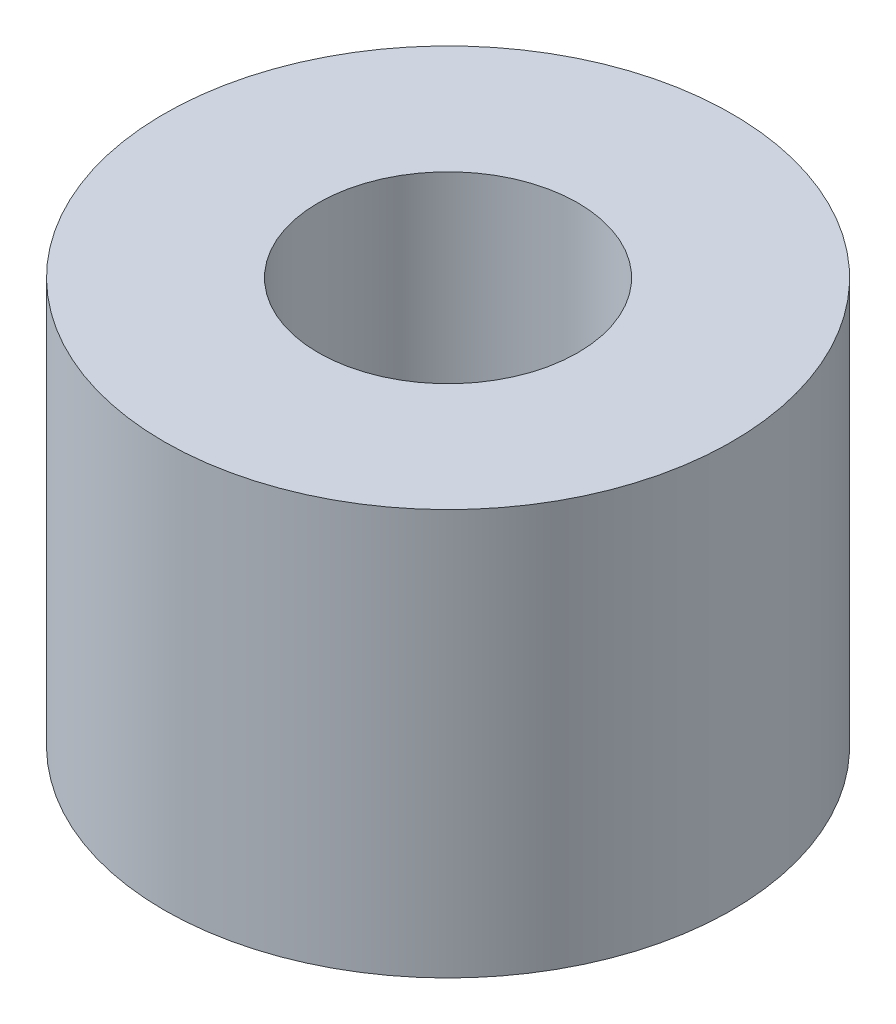
ISO-10303-21;
HEADER;
FILE_DESCRIPTION(('STEP AP214'),'2;1');
FILE_NAME('part.step','',(''),(''),'','','');
FILE_SCHEMA(('AUTOMOTIVE_DESIGN { 1 0 10303 214 1 1 1 1 }'));
ENDSEC;
DATA;
#1=APPLICATION_CONTEXT('core data for automotive mechanical design processes');
#2=APPLICATION_PROTOCOL_DEFINITION('international standard','automotive_design',2000,#1);
#3=PRODUCT_CONTEXT('',#1,'mechanical');
#4=PRODUCT('Part','Part','',(#3));
#5=PRODUCT_RELATED_PRODUCT_CATEGORY('part','',(#4));
#6=PRODUCT_DEFINITION_FORMATION('','',#4);
#7=PRODUCT_DEFINITION_CONTEXT('part definition',#1,'design');
#8=PRODUCT_DEFINITION('design','',#6,#7);
#9=PRODUCT_DEFINITION_SHAPE('','',#8);
#10=(LENGTH_UNIT() NAMED_UNIT(*) SI_UNIT(.MILLI.,.METRE.));
#11=(NAMED_UNIT(*) PLANE_ANGLE_UNIT() SI_UNIT($,.RADIAN.));
#12=(NAMED_UNIT(*) SI_UNIT($,.STERADIAN.) SOLID_ANGLE_UNIT());
#13=UNCERTAINTY_MEASURE_WITH_UNIT(LENGTH_MEASURE(1.E-05),#10,'distance_accuracy_value','');
#14=(GEOMETRIC_REPRESENTATION_CONTEXT(3) GLOBAL_UNCERTAINTY_ASSIGNED_CONTEXT((#13)) GLOBAL_UNIT_ASSIGNED_CONTEXT((#10,
#11,#12)) REPRESENTATION_CONTEXT('',''));
#15=CARTESIAN_POINT('',(0.,0.,0.));
#16=DIRECTION('',(0.,0.,1.));
#17=DIRECTION('',(1.,0.,0.));
#18=AXIS2_PLACEMENT_3D('',#15,#16,#17);
#19=CARTESIAN_POINT('',(0.,2.5,0.));
#20=DIRECTION('',(0.,1.,0.));
#21=DIRECTION('',(0.,0.,1.));
#22=AXIS2_PLACEMENT_3D('',#19,#20,#21);
#23=PLANE('',#22);
#24=CARTESIAN_POINT('',(0.,2.5,0.));
#25=DIRECTION('',(0.,1.,0.));
#26=DIRECTION('',(0.,0.,1.));
#27=AXIS2_PLACEMENT_3D('',#24,#25,#26);
#28=CIRCLE('',#27,3.5);
#29=CARTESIAN_POINT('',(0.,2.5,3.5));
#30=VERTEX_POINT('',#29);
#31=EDGE_CURVE('E10',#30,#30,#28,.T.);
#32=ORIENTED_EDGE('',*,*,#31,.T.);
#33=EDGE_LOOP('',(#32));
#34=FACE_BOUND('',#33,.T.);
#35=CARTESIAN_POINT('',(0.,2.5,0.));
#36=DIRECTION('',(0.,1.,0.));
#37=DIRECTION('',(0.,0.,1.));
#38=AXIS2_PLACEMENT_3D('',#35,#36,#37);
#39=CIRCLE('',#38,1.6);
#40=CARTESIAN_POINT('',(0.,2.5,1.6));
#41=VERTEX_POINT('',#40);
#42=EDGE_CURVE('E44',#41,#41,#39,.T.);
#43=ORIENTED_EDGE('',*,*,#42,.F.);
#44=EDGE_LOOP('',(#43));
#45=FACE_BOUND('',#44,.T.);
#46=ADVANCED_FACE('F33',(#34,#45),#23,.T.);
#47=CARTESIAN_POINT('',(0.,-2.5,0.));
#48=DIRECTION('',(0.,1.,0.));
#49=DIRECTION('',(0.,0.,1.));
#50=AXIS2_PLACEMENT_3D('',#47,#48,#49);
#51=PLANE('',#50);
#52=CARTESIAN_POINT('',(0.,-2.5,0.));
#53=DIRECTION('',(0.,1.,0.));
#54=DIRECTION('',(0.,0.,1.));
#55=AXIS2_PLACEMENT_3D('',#52,#53,#54);
#56=CIRCLE('',#55,3.5);
#57=CARTESIAN_POINT('',(0.,-2.5,3.5));
#58=VERTEX_POINT('',#57);
#59=EDGE_CURVE('E37',#58,#58,#56,.T.);
#60=ORIENTED_EDGE('',*,*,#59,.F.);
#61=EDGE_LOOP('',(#60));
#62=FACE_BOUND('',#61,.T.);
#63=CARTESIAN_POINT('',(0.,-2.5,0.));
#64=DIRECTION('',(0.,1.,0.));
#65=DIRECTION('',(0.,0.,1.));
#66=AXIS2_PLACEMENT_3D('',#63,#64,#65);
#67=CIRCLE('',#66,1.6);
#68=CARTESIAN_POINT('',(0.,-2.5,1.6));
#69=VERTEX_POINT('',#68);
#70=EDGE_CURVE('E46',#69,#69,#67,.T.);
#71=ORIENTED_EDGE('',*,*,#70,.T.);
#72=EDGE_LOOP('',(#71));
#73=FACE_BOUND('',#72,.T.);
#74=ADVANCED_FACE('F56',(#62,#73),#51,.F.);
#75=CARTESIAN_POINT('',(0.,2.5,0.));
#76=DIRECTION('',(0.,-1.,0.));
#77=DIRECTION('',(0.,0.,-1.));
#78=AXIS2_PLACEMENT_3D('',#75,#76,#77);
#79=CYLINDRICAL_SURFACE('',#78,3.5);
#80=ORIENTED_EDGE('',*,*,#31,.F.);
#81=EDGE_LOOP('',(#80));
#82=FACE_BOUND('',#81,.T.);
#83=ORIENTED_EDGE('',*,*,#59,.T.);
#84=EDGE_LOOP('',(#83));
#85=FACE_BOUND('',#84,.T.);
#86=ADVANCED_FACE('F35',(#82,#85),#79,.T.);
#87=CARTESIAN_POINT('',(0.,2.5,0.));
#88=DIRECTION('',(0.,-1.,0.));
#89=DIRECTION('',(0.,0.,-1.));
#90=AXIS2_PLACEMENT_3D('',#87,#88,#89);
#91=CYLINDRICAL_SURFACE('',#90,1.6);
#92=ORIENTED_EDGE('',*,*,#42,.T.);
#93=EDGE_LOOP('',(#92));
#94=FACE_BOUND('',#93,.T.);
#95=ORIENTED_EDGE('',*,*,#70,.F.);
#96=EDGE_LOOP('',(#95));
#97=FACE_BOUND('',#96,.T.);
#98=ADVANCED_FACE('F52',(#94,#97),#91,.F.);
#99=CLOSED_SHELL('',(#46,#74,#86,#98));
#100=MANIFOLD_SOLID_BREP('B2',#99);
#101=ADVANCED_BREP_SHAPE_REPRESENTATION('',(#18,#100),#14);
#102=SHAPE_DEFINITION_REPRESENTATION(#9,#101);
ENDSEC;
END-ISO-10303-21;
